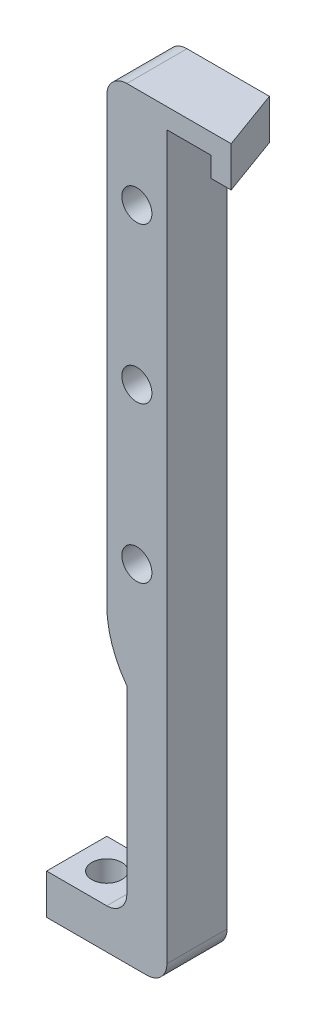
ISO-10303-21;
HEADER;
FILE_DESCRIPTION(('STEP AP214'),'2;1');
FILE_NAME('part.step','',(''),(''),'','','');
FILE_SCHEMA(('AUTOMOTIVE_DESIGN { 1 0 10303 214 1 1 1 1 }'));
ENDSEC;
DATA;
#1=APPLICATION_CONTEXT('core data for automotive mechanical design processes');
#2=APPLICATION_PROTOCOL_DEFINITION('international standard','automotive_design',2000,#1);
#3=PRODUCT_CONTEXT('',#1,'mechanical');
#4=PRODUCT('Part','Part','',(#3));
#5=PRODUCT_RELATED_PRODUCT_CATEGORY('part','',(#4));
#6=PRODUCT_DEFINITION_FORMATION('','',#4);
#7=PRODUCT_DEFINITION_CONTEXT('part definition',#1,'design');
#8=PRODUCT_DEFINITION('design','',#6,#7);
#9=PRODUCT_DEFINITION_SHAPE('','',#8);
#10=(LENGTH_UNIT() NAMED_UNIT(*) SI_UNIT(.MILLI.,.METRE.));
#11=(NAMED_UNIT(*) PLANE_ANGLE_UNIT() SI_UNIT($,.RADIAN.));
#12=(NAMED_UNIT(*) SI_UNIT($,.STERADIAN.) SOLID_ANGLE_UNIT());
#13=UNCERTAINTY_MEASURE_WITH_UNIT(LENGTH_MEASURE(1.E-05),#10,'distance_accuracy_value','');
#14=(GEOMETRIC_REPRESENTATION_CONTEXT(3) GLOBAL_UNCERTAINTY_ASSIGNED_CONTEXT((#13)) GLOBAL_UNIT_ASSIGNED_CONTEXT((#10,
#11,#12)) REPRESENTATION_CONTEXT('',''));
#15=CARTESIAN_POINT('',(0.,0.,0.));
#16=DIRECTION('',(0.,0.,1.));
#17=DIRECTION('',(1.,0.,0.));
#18=AXIS2_PLACEMENT_3D('',#15,#16,#17);
#19=CARTESIAN_POINT('',(15.748,93.98,0.));
#20=DIRECTION('',(0.,1.,0.));
#21=DIRECTION('',(0.,0.,1.));
#22=AXIS2_PLACEMENT_3D('',#19,#20,#21);
#23=PLANE('',#22);
#24=DIRECTION('',(-0.342020143325663,0.,-0.93969262078591));
#25=VECTOR('',#24,1.);
#26=CARTESIAN_POINT('',(10.4345468148915,93.98,-7.62));
#27=LINE('',#26,#25);
#28=CARTESIAN_POINT('',(13.2079999999999,93.98,0.));
#29=VERTEX_POINT('',#28);
#30=CARTESIAN_POINT('',(10.4345468148915,93.98,-7.62));
#31=VERTEX_POINT('',#30);
#32=EDGE_CURVE('E179',#29,#31,#27,.T.);
#33=ORIENTED_EDGE('',*,*,#32,.F.);
#34=DIRECTION('',(-1.,0.,0.));
#35=VECTOR('',#34,1.);
#36=CARTESIAN_POINT('',(15.748,93.98,0.));
#37=LINE('',#36,#35);
#38=CARTESIAN_POINT('',(7.62,93.9799999999999,0.));
#39=VERTEX_POINT('',#38);
#40=EDGE_CURVE('E221',#29,#39,#37,.T.);
#41=ORIENTED_EDGE('',*,*,#40,.T.);
#42=DIRECTION('',(0.,0.,-1.));
#43=VECTOR('',#42,1.);
#44=CARTESIAN_POINT('',(7.62,93.98,0.));
#45=LINE('',#44,#43);
#46=CARTESIAN_POINT('',(7.62,93.98,-7.62));
#47=VERTEX_POINT('',#46);
#48=EDGE_CURVE('E200',#39,#47,#45,.T.);
#49=ORIENTED_EDGE('',*,*,#48,.T.);
#50=DIRECTION('',(-1.,0.,0.));
#51=VECTOR('',#50,1.);
#52=CARTESIAN_POINT('',(15.748,93.98,-7.62));
#53=LINE('',#52,#51);
#54=EDGE_CURVE('E203',#31,#47,#53,.T.);
#55=ORIENTED_EDGE('',*,*,#54,.F.);
#56=EDGE_LOOP('',(#33,#41,#49,#55));
#57=FACE_BOUND('',#56,.T.);
#58=ADVANCED_FACE('F33',(#57),#23,.F.);
#59=CARTESIAN_POINT('',(7.62,0.,0.));
#60=DIRECTION('',(-1.,0.,0.));
#61=DIRECTION('',(0.,0.,1.));
#62=AXIS2_PLACEMENT_3D('',#59,#60,#61);
#63=PLANE('',#62);
#64=DIRECTION('',(0.,-1.,0.));
#65=VECTOR('',#64,1.);
#66=CARTESIAN_POINT('',(7.62,0.,0.));
#67=LINE('',#66,#65);
#68=CARTESIAN_POINT('',(7.62,2.54,0.));
#69=VERTEX_POINT('',#68);
#70=EDGE_CURVE('E212',#39,#69,#67,.T.);
#71=ORIENTED_EDGE('',*,*,#70,.T.);
#72=DIRECTION('',(0.,0.,-1.));
#73=VECTOR('',#72,1.);
#74=CARTESIAN_POINT('',(7.62,2.54,0.));
#75=LINE('',#74,#73);
#76=CARTESIAN_POINT('',(7.62,2.54,-7.62));
#77=VERTEX_POINT('',#76);
#78=EDGE_CURVE('E162',#69,#77,#75,.T.);
#79=ORIENTED_EDGE('',*,*,#78,.T.);
#80=DIRECTION('',(0.,1.,0.));
#81=VECTOR('',#80,1.);
#82=CARTESIAN_POINT('',(7.62,0.,-7.62));
#83=LINE('',#82,#81);
#84=EDGE_CURVE('E237',#77,#47,#83,.T.);
#85=ORIENTED_EDGE('',*,*,#84,.T.);
#86=ORIENTED_EDGE('',*,*,#48,.F.);
#87=EDGE_LOOP('',(#71,#79,#85,#86));
#88=FACE_BOUND('',#87,.T.);
#89=ADVANCED_FACE('F324',(#88),#63,.F.);
#90=CARTESIAN_POINT('',(7.62,0.,0.));
#91=DIRECTION('',(0.,0.,-1.));
#92=DIRECTION('',(-1.,0.,0.));
#93=AXIS2_PLACEMENT_3D('',#90,#91,#92);
#94=PLANE('',#93);
#95=CARTESIAN_POINT('',(3.81,64.135,0.));
#96=DIRECTION('',(0.,0.,1.));
#97=DIRECTION('',(1.,0.,0.));
#98=AXIS2_PLACEMENT_3D('',#95,#96,#97);
#99=CIRCLE('',#98,1.905);
#100=CARTESIAN_POINT('',(5.715,64.135,0.));
#101=VERTEX_POINT('',#100);
#102=EDGE_CURVE('E285',#101,#101,#99,.T.);
#103=ORIENTED_EDGE('',*,*,#102,.F.);
#104=EDGE_LOOP('',(#103));
#105=FACE_BOUND('',#104,.T.);
#106=CARTESIAN_POINT('',(3.81,44.45,0.));
#107=DIRECTION('',(0.,0.,1.));
#108=DIRECTION('',(1.,0.,0.));
#109=AXIS2_PLACEMENT_3D('',#106,#107,#108);
#110=CIRCLE('',#109,1.905);
#111=CARTESIAN_POINT('',(5.715,44.45,0.));
#112=VERTEX_POINT('',#111);
#113=EDGE_CURVE('E275',#112,#112,#110,.T.);
#114=ORIENTED_EDGE('',*,*,#113,.F.);
#115=EDGE_LOOP('',(#114));
#116=FACE_BOUND('',#115,.T.);
#117=CARTESIAN_POINT('',(3.81,83.82,0.));
#118=DIRECTION('',(0.,0.,1.));
#119=DIRECTION('',(1.,0.,0.));
#120=AXIS2_PLACEMENT_3D('',#117,#118,#119);
#121=CIRCLE('',#120,1.90500000000001);
#122=CARTESIAN_POINT('',(5.71500000000001,83.82,0.));
#123=VERTEX_POINT('',#122);
#124=EDGE_CURVE('E272',#123,#123,#121,.T.);
#125=ORIENTED_EDGE('',*,*,#124,.F.);
#126=EDGE_LOOP('',(#125));
#127=FACE_BOUND('',#126,.T.);
#128=DIRECTION('',(-1.,0.,0.));
#129=VECTOR('',#128,1.);
#130=CARTESIAN_POINT('',(7.62,0.,0.));
#131=LINE('',#130,#129);
#132=CARTESIAN_POINT('',(5.08,0.,0.));
#133=VERTEX_POINT('',#132);
#134=CARTESIAN_POINT('',(-7.62,0.,0.));
#135=VERTEX_POINT('',#134);
#136=EDGE_CURVE('E242',#133,#135,#131,.T.);
#137=ORIENTED_EDGE('',*,*,#136,.F.);
#138=CARTESIAN_POINT('',(5.08,2.54,0.));
#139=DIRECTION('',(0.,0.,-1.));
#140=DIRECTION('',(-1.,0.,0.));
#141=AXIS2_PLACEMENT_3D('',#138,#139,#140);
#142=CIRCLE('',#141,2.54);
#143=EDGE_CURVE('E260',#133,#69,#142,.F.);
#144=ORIENTED_EDGE('',*,*,#143,.T.);
#145=ORIENTED_EDGE('',*,*,#70,.F.);
#146=ORIENTED_EDGE('',*,*,#40,.F.);
#147=DIRECTION('',(0.,1.,0.));
#148=VECTOR('',#147,1.);
#149=CARTESIAN_POINT('',(13.2079999999999,91.44,0.));
#150=LINE('',#149,#148);
#151=CARTESIAN_POINT('',(13.2079999999999,91.44,0.));
#152=VERTEX_POINT('',#151);
#153=EDGE_CURVE('E197',#152,#29,#150,.T.);
#154=ORIENTED_EDGE('',*,*,#153,.F.);
#155=DIRECTION('',(-1.,0.,0.));
#156=VECTOR('',#155,1.);
#157=CARTESIAN_POINT('',(15.748,91.44,0.));
#158=LINE('',#157,#156);
#159=CARTESIAN_POINT('',(15.748,91.44,0.));
#160=VERTEX_POINT('',#159);
#161=EDGE_CURVE('E180',#160,#152,#158,.T.);
#162=ORIENTED_EDGE('',*,*,#161,.F.);
#163=DIRECTION('',(0.,-1.,0.));
#164=VECTOR('',#163,1.);
#165=CARTESIAN_POINT('',(15.748,96.52,0.));
#166=LINE('',#165,#164);
#167=CARTESIAN_POINT('',(15.748,96.52,0.));
#168=VERTEX_POINT('',#167);
#169=EDGE_CURVE('E201',#168,#160,#166,.T.);
#170=ORIENTED_EDGE('',*,*,#169,.F.);
#171=DIRECTION('',(-1.,0.,0.));
#172=VECTOR('',#171,1.);
#173=CARTESIAN_POINT('',(7.62,96.52,0.));
#174=LINE('',#173,#172);
#175=CARTESIAN_POINT('',(2.54,96.52,0.));
#176=VERTEX_POINT('',#175);
#177=EDGE_CURVE('E233',#168,#176,#174,.T.);
#178=ORIENTED_EDGE('',*,*,#177,.T.);
#179=CARTESIAN_POINT('',(2.54,93.98,0.));
#180=DIRECTION('',(0.,0.,-1.));
#181=DIRECTION('',(-1.,0.,0.));
#182=AXIS2_PLACEMENT_3D('',#179,#180,#181);
#183=CIRCLE('',#182,2.54);
#184=CARTESIAN_POINT('',(0.,93.98,0.));
#185=VERTEX_POINT('',#184);
#186=EDGE_CURVE('E50',#176,#185,#183,.F.);
#187=ORIENTED_EDGE('',*,*,#186,.T.);
#188=DIRECTION('',(0.,-1.,0.));
#189=VECTOR('',#188,1.);
#190=CARTESIAN_POINT('',(0.,0.,0.));
#191=LINE('',#190,#189);
#192=CARTESIAN_POINT('',(0.,38.1,0.));
#193=VERTEX_POINT('',#192);
#194=EDGE_CURVE('E158',#185,#193,#191,.T.);
#195=ORIENTED_EDGE('',*,*,#194,.T.);
#196=CARTESIAN_POINT('',(12.7,38.1,0.));
#197=DIRECTION('',(0.,0.,-1.));
#198=DIRECTION('',(-1.,0.,0.));
#199=AXIS2_PLACEMENT_3D('',#196,#197,#198);
#200=CIRCLE('',#199,12.7);
#201=CARTESIAN_POINT('',(2.54,30.48,0.));
#202=VERTEX_POINT('',#201);
#203=EDGE_CURVE('E154',#193,#202,#200,.F.);
#204=ORIENTED_EDGE('',*,*,#203,.T.);
#205=DIRECTION('',(0.,1.,0.));
#206=VECTOR('',#205,1.);
#207=CARTESIAN_POINT('',(2.54,5.08,0.));
#208=LINE('',#207,#206);
#209=CARTESIAN_POINT('',(2.54,7.62,0.));
#210=VERTEX_POINT('',#209);
#211=EDGE_CURVE('E142',#210,#202,#208,.T.);
#212=ORIENTED_EDGE('',*,*,#211,.F.);
#213=CARTESIAN_POINT('',(0.,7.62,0.));
#214=DIRECTION('',(0.,0.,-1.));
#215=DIRECTION('',(-1.,0.,0.));
#216=AXIS2_PLACEMENT_3D('',#213,#214,#215);
#217=CIRCLE('',#216,2.54);
#218=CARTESIAN_POINT('',(0.,5.08,0.));
#219=VERTEX_POINT('',#218);
#220=EDGE_CURVE('E42',#210,#219,#217,.T.);
#221=ORIENTED_EDGE('',*,*,#220,.T.);
#222=DIRECTION('',(1.,0.,0.));
#223=VECTOR('',#222,1.);
#224=CARTESIAN_POINT('',(-7.62,5.08,0.));
#225=LINE('',#224,#223);
#226=CARTESIAN_POINT('',(-7.62,5.08,0.));
#227=VERTEX_POINT('',#226);
#228=EDGE_CURVE('E247',#227,#219,#225,.T.);
#229=ORIENTED_EDGE('',*,*,#228,.F.);
#230=DIRECTION('',(0.,1.,0.));
#231=VECTOR('',#230,1.);
#232=CARTESIAN_POINT('',(-7.62,0.,0.));
#233=LINE('',#232,#231);
#234=EDGE_CURVE('E206',#135,#227,#233,.T.);
#235=ORIENTED_EDGE('',*,*,#234,.F.);
#236=EDGE_LOOP('',(#137,#144,#145,#146,#154,#162,#170,#178,#187,#195,#204,#212,#221,#229,#235));
#237=FACE_BOUND('',#236,.T.);
#238=ADVANCED_FACE('F156',(#105,#116,#127,#237),#94,.F.);
#239=CARTESIAN_POINT('',(7.62,0.,0.));
#240=DIRECTION('',(0.,1.,0.));
#241=DIRECTION('',(0.,0.,1.));
#242=AXIS2_PLACEMENT_3D('',#239,#240,#241);
#243=PLANE('',#242);
#244=CARTESIAN_POINT('',(-3.81,0.,-3.81));
#245=DIRECTION('',(0.,1.,0.));
#246=DIRECTION('',(0.,0.,1.));
#247=AXIS2_PLACEMENT_3D('',#244,#245,#246);
#248=CIRCLE('',#247,1.89865);
#249=CARTESIAN_POINT('',(-3.81,0.,-1.91135));
#250=VERTEX_POINT('',#249);
#251=EDGE_CURVE('E176',#250,#250,#248,.T.);
#252=ORIENTED_EDGE('',*,*,#251,.T.);
#253=EDGE_LOOP('',(#252));
#254=FACE_BOUND('',#253,.T.);
#255=DIRECTION('',(-1.,0.,0.));
#256=VECTOR('',#255,1.);
#257=CARTESIAN_POINT('',(7.62,0.,-7.62));
#258=LINE('',#257,#256);
#259=CARTESIAN_POINT('',(5.08,0.,-7.62));
#260=VERTEX_POINT('',#259);
#261=CARTESIAN_POINT('',(-7.62,0.,-7.62));
#262=VERTEX_POINT('',#261);
#263=EDGE_CURVE('E240',#260,#262,#258,.T.);
#264=ORIENTED_EDGE('',*,*,#263,.F.);
#265=DIRECTION('',(0.,0.,-1.));
#266=VECTOR('',#265,1.);
#267=CARTESIAN_POINT('',(5.08,0.,0.));
#268=LINE('',#267,#266);
#269=EDGE_CURVE('E257',#260,#133,#268,.F.);
#270=ORIENTED_EDGE('',*,*,#269,.T.);
#271=ORIENTED_EDGE('',*,*,#136,.T.);
#272=DIRECTION('',(0.,0.,1.));
#273=VECTOR('',#272,1.);
#274=CARTESIAN_POINT('',(-7.62,0.,0.));
#275=LINE('',#274,#273);
#276=EDGE_CURVE('E248',#262,#135,#275,.T.);
#277=ORIENTED_EDGE('',*,*,#276,.F.);
#278=EDGE_LOOP('',(#264,#270,#271,#277));
#279=FACE_BOUND('',#278,.T.);
#280=ADVANCED_FACE('F314',(#254,#279),#243,.F.);
#281=CARTESIAN_POINT('',(7.62,0.,-7.62));
#282=DIRECTION('',(0.,0.,1.));
#283=DIRECTION('',(1.,0.,0.));
#284=AXIS2_PLACEMENT_3D('',#281,#282,#283);
#285=PLANE('',#284);
#286=CARTESIAN_POINT('',(3.81,64.135,-7.62));
#287=DIRECTION('',(0.,0.,1.));
#288=DIRECTION('',(1.,0.,0.));
#289=AXIS2_PLACEMENT_3D('',#286,#287,#288);
#290=CIRCLE('',#289,1.905);
#291=CARTESIAN_POINT('',(5.715,64.135,-7.62));
#292=VERTEX_POINT('',#291);
#293=EDGE_CURVE('E37',#292,#292,#290,.T.);
#294=ORIENTED_EDGE('',*,*,#293,.T.);
#295=EDGE_LOOP('',(#294));
#296=FACE_BOUND('',#295,.T.);
#297=CARTESIAN_POINT('',(3.81,44.45,-7.62));
#298=DIRECTION('',(0.,0.,1.));
#299=DIRECTION('',(1.,0.,0.));
#300=AXIS2_PLACEMENT_3D('',#297,#298,#299);
#301=CIRCLE('',#300,1.905);
#302=CARTESIAN_POINT('',(5.715,44.45,-7.62));
#303=VERTEX_POINT('',#302);
#304=EDGE_CURVE('E273',#303,#303,#301,.T.);
#305=ORIENTED_EDGE('',*,*,#304,.T.);
#306=EDGE_LOOP('',(#305));
#307=FACE_BOUND('',#306,.T.);
#308=CARTESIAN_POINT('',(3.81,83.82,-7.62));
#309=DIRECTION('',(0.,0.,1.));
#310=DIRECTION('',(1.,0.,0.));
#311=AXIS2_PLACEMENT_3D('',#308,#309,#310);
#312=CIRCLE('',#311,1.90500000000001);
#313=CARTESIAN_POINT('',(5.71500000000001,83.82,-7.62));
#314=VERTEX_POINT('',#313);
#315=EDGE_CURVE('E270',#314,#314,#312,.T.);
#316=ORIENTED_EDGE('',*,*,#315,.T.);
#317=EDGE_LOOP('',(#316));
#318=FACE_BOUND('',#317,.T.);
#319=ORIENTED_EDGE('',*,*,#84,.F.);
#320=CARTESIAN_POINT('',(5.08,2.54,-7.62));
#321=DIRECTION('',(0.,0.,1.));
#322=DIRECTION('',(1.,0.,0.));
#323=AXIS2_PLACEMENT_3D('',#320,#321,#322);
#324=CIRCLE('',#323,2.54);
#325=EDGE_CURVE('E311',#77,#260,#324,.F.);
#326=ORIENTED_EDGE('',*,*,#325,.T.);
#327=ORIENTED_EDGE('',*,*,#263,.T.);
#328=DIRECTION('',(0.,-1.,0.));
#329=VECTOR('',#328,1.);
#330=CARTESIAN_POINT('',(-7.62,0.,-7.62));
#331=LINE('',#330,#329);
#332=CARTESIAN_POINT('',(-7.62,5.08,-7.62));
#333=VERTEX_POINT('',#332);
#334=EDGE_CURVE('E296',#333,#262,#331,.T.);
#335=ORIENTED_EDGE('',*,*,#334,.F.);
#336=DIRECTION('',(1.,0.,0.));
#337=VECTOR('',#336,1.);
#338=CARTESIAN_POINT('',(-7.62,5.08,-7.62));
#339=LINE('',#338,#337);
#340=CARTESIAN_POINT('',(0.,5.08,-7.62));
#341=VERTEX_POINT('',#340);
#342=EDGE_CURVE('E244',#333,#341,#339,.T.);
#343=ORIENTED_EDGE('',*,*,#342,.T.);
#344=CARTESIAN_POINT('',(0.,7.62,-7.62));
#345=DIRECTION('',(0.,0.,1.));
#346=DIRECTION('',(1.,0.,0.));
#347=AXIS2_PLACEMENT_3D('',#344,#345,#346);
#348=CIRCLE('',#347,2.54);
#349=CARTESIAN_POINT('',(2.54,7.62,-7.62));
#350=VERTEX_POINT('',#349);
#351=EDGE_CURVE('E11',#341,#350,#348,.T.);
#352=ORIENTED_EDGE('',*,*,#351,.T.);
#353=DIRECTION('',(0.,-1.,0.));
#354=VECTOR('',#353,1.);
#355=CARTESIAN_POINT('',(2.54,5.08,-7.62));
#356=LINE('',#355,#354);
#357=CARTESIAN_POINT('',(2.54,30.48,-7.62));
#358=VERTEX_POINT('',#357);
#359=EDGE_CURVE('E151',#358,#350,#356,.T.);
#360=ORIENTED_EDGE('',*,*,#359,.F.);
#361=CARTESIAN_POINT('',(12.7,38.1,-7.62));
#362=DIRECTION('',(0.,0.,1.));
#363=DIRECTION('',(1.,0.,0.));
#364=AXIS2_PLACEMENT_3D('',#361,#362,#363);
#365=CIRCLE('',#364,12.7);
#366=CARTESIAN_POINT('',(0.,38.1,-7.62));
#367=VERTEX_POINT('',#366);
#368=EDGE_CURVE('E166',#358,#367,#365,.F.);
#369=ORIENTED_EDGE('',*,*,#368,.T.);
#370=DIRECTION('',(0.,1.,0.));
#371=VECTOR('',#370,1.);
#372=CARTESIAN_POINT('',(0.,0.,-7.62));
#373=LINE('',#372,#371);
#374=CARTESIAN_POINT('',(0.,93.98,-7.62));
#375=VERTEX_POINT('',#374);
#376=EDGE_CURVE('E223',#367,#375,#373,.T.);
#377=ORIENTED_EDGE('',*,*,#376,.T.);
#378=CARTESIAN_POINT('',(2.54,93.98,-7.62));
#379=DIRECTION('',(0.,0.,1.));
#380=DIRECTION('',(1.,0.,0.));
#381=AXIS2_PLACEMENT_3D('',#378,#379,#380);
#382=CIRCLE('',#381,2.54);
#383=CARTESIAN_POINT('',(2.54,96.52,-7.62));
#384=VERTEX_POINT('',#383);
#385=EDGE_CURVE('E310',#375,#384,#382,.F.);
#386=ORIENTED_EDGE('',*,*,#385,.T.);
#387=DIRECTION('',(-1.,0.,0.));
#388=VECTOR('',#387,1.);
#389=CARTESIAN_POINT('',(7.62,96.52,-7.62));
#390=LINE('',#389,#388);
#391=CARTESIAN_POINT('',(12.9745468148915,96.52,-7.62));
#392=VERTEX_POINT('',#391);
#393=EDGE_CURVE('E236',#392,#384,#390,.T.);
#394=ORIENTED_EDGE('',*,*,#393,.F.);
#395=DIRECTION('',(0.,1.,0.));
#396=VECTOR('',#395,1.);
#397=CARTESIAN_POINT('',(12.9745468148915,91.44,-7.62));
#398=LINE('',#397,#396);
#399=CARTESIAN_POINT('',(12.9745468148915,91.44,-7.62));
#400=VERTEX_POINT('',#399);
#401=EDGE_CURVE('E190',#400,#392,#398,.T.);
#402=ORIENTED_EDGE('',*,*,#401,.F.);
#403=DIRECTION('',(1.,0.,0.));
#404=VECTOR('',#403,1.);
#405=CARTESIAN_POINT('',(10.4345468148915,91.44,-7.62));
#406=LINE('',#405,#404);
#407=CARTESIAN_POINT('',(10.4345468148915,91.44,-7.62));
#408=VERTEX_POINT('',#407);
#409=EDGE_CURVE('E185',#408,#400,#406,.T.);
#410=ORIENTED_EDGE('',*,*,#409,.F.);
#411=DIRECTION('',(0.,1.,0.));
#412=VECTOR('',#411,1.);
#413=CARTESIAN_POINT('',(10.4345468148915,91.44,-7.62));
#414=LINE('',#413,#412);
#415=EDGE_CURVE('E194',#408,#31,#414,.T.);
#416=ORIENTED_EDGE('',*,*,#415,.T.);
#417=ORIENTED_EDGE('',*,*,#54,.T.);
#418=EDGE_LOOP('',(#319,#326,#327,#335,#343,#352,#360,#369,#377,#386,#394,#402,#410,#416,#417));
#419=FACE_BOUND('',#418,.T.);
#420=ADVANCED_FACE('F294',(#296,#307,#318,#419),#285,.F.);
#421=CARTESIAN_POINT('',(7.62,96.52,0.));
#422=DIRECTION('',(0.,-1.,0.));
#423=DIRECTION('',(0.,0.,-1.));
#424=AXIS2_PLACEMENT_3D('',#421,#422,#423);
#425=PLANE('',#424);
#426=ORIENTED_EDGE('',*,*,#393,.T.);
#427=DIRECTION('',(0.,0.,1.));
#428=VECTOR('',#427,1.);
#429=CARTESIAN_POINT('',(2.54,96.52,0.));
#430=LINE('',#429,#428);
#431=EDGE_CURVE('E262',#384,#176,#430,.T.);
#432=ORIENTED_EDGE('',*,*,#431,.T.);
#433=ORIENTED_EDGE('',*,*,#177,.F.);
#434=DIRECTION('',(-0.342020143325669,0.,-0.939692620785908));
#435=VECTOR('',#434,1.);
#436=CARTESIAN_POINT('',(12.9745468148915,96.52,-7.62));
#437=LINE('',#436,#435);
#438=EDGE_CURVE('E167',#168,#392,#437,.T.);
#439=ORIENTED_EDGE('',*,*,#438,.T.);
#440=EDGE_LOOP('',(#426,#432,#433,#439));
#441=FACE_BOUND('',#440,.T.);
#442=ADVANCED_FACE('F344',(#441),#425,.F.);
#443=CARTESIAN_POINT('',(0.,0.,0.));
#444=DIRECTION('',(-1.,0.,0.));
#445=DIRECTION('',(0.,0.,1.));
#446=AXIS2_PLACEMENT_3D('',#443,#444,#445);
#447=PLANE('',#446);
#448=ORIENTED_EDGE('',*,*,#194,.F.);
#449=DIRECTION('',(0.,0.,1.));
#450=VECTOR('',#449,1.);
#451=CARTESIAN_POINT('',(0.,93.98,-7.62));
#452=LINE('',#451,#450);
#453=EDGE_CURVE('E264',#185,#375,#452,.F.);
#454=ORIENTED_EDGE('',*,*,#453,.T.);
#455=ORIENTED_EDGE('',*,*,#376,.F.);
#456=DIRECTION('',(0.,0.,1.));
#457=VECTOR('',#456,1.);
#458=CARTESIAN_POINT('',(0.,38.1,0.));
#459=LINE('',#458,#457);
#460=EDGE_CURVE('E163',#367,#193,#459,.T.);
#461=ORIENTED_EDGE('',*,*,#460,.T.);
#462=EDGE_LOOP('',(#448,#454,#455,#461));
#463=FACE_BOUND('',#462,.T.);
#464=ADVANCED_FACE('F349',(#463),#447,.T.);
#465=CARTESIAN_POINT('',(-7.62,5.08,0.));
#466=DIRECTION('',(0.,-1.,0.));
#467=DIRECTION('',(0.,0.,-1.));
#468=AXIS2_PLACEMENT_3D('',#465,#466,#467);
#469=PLANE('',#468);
#470=CARTESIAN_POINT('',(-3.81,5.08,-3.81));
#471=DIRECTION('',(0.,1.,0.));
#472=DIRECTION('',(0.,0.,1.));
#473=AXIS2_PLACEMENT_3D('',#470,#471,#472);
#474=CIRCLE('',#473,1.89865);
#475=CARTESIAN_POINT('',(-3.81,5.08,-1.91135));
#476=VERTEX_POINT('',#475);
#477=EDGE_CURVE('E170',#476,#476,#474,.T.);
#478=ORIENTED_EDGE('',*,*,#477,.F.);
#479=EDGE_LOOP('',(#478));
#480=FACE_BOUND('',#479,.T.);
#481=ORIENTED_EDGE('',*,*,#228,.T.);
#482=DIRECTION('',(0.,0.,1.));
#483=VECTOR('',#482,1.);
#484=CARTESIAN_POINT('',(0.,5.08,-7.62));
#485=LINE('',#484,#483);
#486=EDGE_CURVE('E267',#219,#341,#485,.F.);
#487=ORIENTED_EDGE('',*,*,#486,.T.);
#488=ORIENTED_EDGE('',*,*,#342,.F.);
#489=DIRECTION('',(0.,0.,-1.));
#490=VECTOR('',#489,1.);
#491=CARTESIAN_POINT('',(-7.62,5.08,0.));
#492=LINE('',#491,#490);
#493=EDGE_CURVE('E301',#227,#333,#492,.T.);
#494=ORIENTED_EDGE('',*,*,#493,.F.);
#495=EDGE_LOOP('',(#481,#487,#488,#494));
#496=FACE_BOUND('',#495,.T.);
#497=ADVANCED_FACE('F291',(#480,#496),#469,.F.);
#498=CARTESIAN_POINT('',(-7.62,0.,0.));
#499=DIRECTION('',(-1.,0.,0.));
#500=DIRECTION('',(0.,0.,1.));
#501=AXIS2_PLACEMENT_3D('',#498,#499,#500);
#502=PLANE('',#501);
#503=ORIENTED_EDGE('',*,*,#234,.T.);
#504=ORIENTED_EDGE('',*,*,#493,.T.);
#505=ORIENTED_EDGE('',*,*,#334,.T.);
#506=ORIENTED_EDGE('',*,*,#276,.T.);
#507=EDGE_LOOP('',(#503,#504,#505,#506));
#508=FACE_BOUND('',#507,.T.);
#509=ADVANCED_FACE('F356',(#508),#502,.T.);
#510=CARTESIAN_POINT('',(10.4345468148915,91.44,-7.62));
#511=DIRECTION('',(0.939692620785911,0.,-0.342020143325663));
#512=DIRECTION('',(-0.342020143325663,0.,-0.939692620785911));
#513=AXIS2_PLACEMENT_3D('',#510,#511,#512);
#514=PLANE('',#513);
#515=ORIENTED_EDGE('',*,*,#32,.T.);
#516=ORIENTED_EDGE('',*,*,#415,.F.);
#517=DIRECTION('',(-0.342020143325663,0.,-0.93969262078591));
#518=VECTOR('',#517,1.);
#519=CARTESIAN_POINT('',(10.4345468148915,91.44,-7.62));
#520=LINE('',#519,#518);
#521=EDGE_CURVE('E183',#152,#408,#520,.T.);
#522=ORIENTED_EDGE('',*,*,#521,.F.);
#523=ORIENTED_EDGE('',*,*,#153,.T.);
#524=EDGE_LOOP('',(#515,#516,#522,#523));
#525=FACE_BOUND('',#524,.T.);
#526=ADVANCED_FACE('F333',(#525),#514,.F.);
#527=CARTESIAN_POINT('',(15.748,91.44,0.));
#528=DIRECTION('',(-0.939692620785908,0.,0.342020143325669));
#529=DIRECTION('',(0.342020143325669,0.,0.939692620785908));
#530=AXIS2_PLACEMENT_3D('',#527,#528,#529);
#531=PLANE('',#530);
#532=ORIENTED_EDGE('',*,*,#401,.T.);
#533=ORIENTED_EDGE('',*,*,#438,.F.);
#534=ORIENTED_EDGE('',*,*,#169,.T.);
#535=DIRECTION('',(0.342020143325669,0.,0.939692620785908));
#536=VECTOR('',#535,1.);
#537=CARTESIAN_POINT('',(15.748,91.44,0.));
#538=LINE('',#537,#536);
#539=EDGE_CURVE('E187',#400,#160,#538,.T.);
#540=ORIENTED_EDGE('',*,*,#539,.F.);
#541=EDGE_LOOP('',(#532,#533,#534,#540));
#542=FACE_BOUND('',#541,.T.);
#543=ADVANCED_FACE('F340',(#542),#531,.F.);
#544=CARTESIAN_POINT('',(0.,91.44,0.));
#545=DIRECTION('',(0.,1.,0.));
#546=DIRECTION('',(0.,0.,1.));
#547=AXIS2_PLACEMENT_3D('',#544,#545,#546);
#548=PLANE('',#547);
#549=ORIENTED_EDGE('',*,*,#161,.T.);
#550=ORIENTED_EDGE('',*,*,#521,.T.);
#551=ORIENTED_EDGE('',*,*,#409,.T.);
#552=ORIENTED_EDGE('',*,*,#539,.T.);
#553=EDGE_LOOP('',(#549,#550,#551,#552));
#554=FACE_BOUND('',#553,.T.);
#555=ADVANCED_FACE('F335',(#554),#548,.F.);
#556=CARTESIAN_POINT('',(-3.81,5.08,-3.81));
#557=DIRECTION('',(0.,1.,0.));
#558=DIRECTION('',(0.,0.,1.));
#559=AXIS2_PLACEMENT_3D('',#556,#557,#558);
#560=CYLINDRICAL_SURFACE('',#559,1.89865);
#561=ORIENTED_EDGE('',*,*,#251,.F.);
#562=EDGE_LOOP('',(#561));
#563=FACE_BOUND('',#562,.T.);
#564=ORIENTED_EDGE('',*,*,#477,.T.);
#565=EDGE_LOOP('',(#564));
#566=FACE_BOUND('',#565,.T.);
#567=ADVANCED_FACE('F379',(#563,#566),#560,.F.);
#568=CARTESIAN_POINT('',(2.54,0.,0.));
#569=DIRECTION('',(1.,0.,0.));
#570=DIRECTION('',(0.,0.,-1.));
#571=AXIS2_PLACEMENT_3D('',#568,#569,#570);
#572=PLANE('',#571);
#573=ORIENTED_EDGE('',*,*,#359,.T.);
#574=DIRECTION('',(0.,0.,1.));
#575=VECTOR('',#574,1.);
#576=CARTESIAN_POINT('',(2.54,7.62,0.));
#577=LINE('',#576,#575);
#578=EDGE_CURVE('E150',#350,#210,#577,.T.);
#579=ORIENTED_EDGE('',*,*,#578,.T.);
#580=ORIENTED_EDGE('',*,*,#211,.T.);
#581=DIRECTION('',(0.,0.,-1.));
#582=VECTOR('',#581,1.);
#583=CARTESIAN_POINT('',(2.54,30.48,-7.62));
#584=LINE('',#583,#582);
#585=EDGE_CURVE('E147',#202,#358,#584,.T.);
#586=ORIENTED_EDGE('',*,*,#585,.T.);
#587=EDGE_LOOP('',(#573,#579,#580,#586));
#588=FACE_BOUND('',#587,.T.);
#589=ADVANCED_FACE('F145',(#588),#572,.F.);
#590=CARTESIAN_POINT('',(12.7,38.1,-7.62));
#591=DIRECTION('',(0.,0.,-1.));
#592=DIRECTION('',(-1.,0.,0.));
#593=AXIS2_PLACEMENT_3D('',#590,#591,#592);
#594=CYLINDRICAL_SURFACE('',#593,12.7);
#595=ORIENTED_EDGE('',*,*,#203,.F.);
#596=ORIENTED_EDGE('',*,*,#460,.F.);
#597=ORIENTED_EDGE('',*,*,#368,.F.);
#598=ORIENTED_EDGE('',*,*,#585,.F.);
#599=EDGE_LOOP('',(#595,#596,#597,#598));
#600=FACE_BOUND('',#599,.T.);
#601=ADVANCED_FACE('F165',(#600),#594,.T.);
#602=CARTESIAN_POINT('',(5.08,2.54,0.));
#603=DIRECTION('',(0.,0.,-1.));
#604=DIRECTION('',(-1.,0.,0.));
#605=AXIS2_PLACEMENT_3D('',#602,#603,#604);
#606=CYLINDRICAL_SURFACE('',#605,2.54);
#607=ORIENTED_EDGE('',*,*,#143,.F.);
#608=ORIENTED_EDGE('',*,*,#269,.F.);
#609=ORIENTED_EDGE('',*,*,#325,.F.);
#610=ORIENTED_EDGE('',*,*,#78,.F.);
#611=EDGE_LOOP('',(#607,#608,#609,#610));
#612=FACE_BOUND('',#611,.T.);
#613=ADVANCED_FACE('F322',(#612),#606,.T.);
#614=CARTESIAN_POINT('',(2.54,93.98,0.));
#615=DIRECTION('',(0.,0.,-1.));
#616=DIRECTION('',(-1.,0.,0.));
#617=AXIS2_PLACEMENT_3D('',#614,#615,#616);
#618=CYLINDRICAL_SURFACE('',#617,2.54);
#619=ORIENTED_EDGE('',*,*,#385,.F.);
#620=ORIENTED_EDGE('',*,*,#453,.F.);
#621=ORIENTED_EDGE('',*,*,#186,.F.);
#622=ORIENTED_EDGE('',*,*,#431,.F.);
#623=EDGE_LOOP('',(#619,#620,#621,#622));
#624=FACE_BOUND('',#623,.T.);
#625=ADVANCED_FACE('F346',(#624),#618,.T.);
#626=CARTESIAN_POINT('',(0.,7.62,0.));
#627=DIRECTION('',(0.,0.,-1.));
#628=DIRECTION('',(0.,1.,0.));
#629=AXIS2_PLACEMENT_3D('',#626,#627,#628);
#630=CYLINDRICAL_SURFACE('',#629,2.54);
#631=ORIENTED_EDGE('',*,*,#351,.F.);
#632=ORIENTED_EDGE('',*,*,#486,.F.);
#633=ORIENTED_EDGE('',*,*,#220,.F.);
#634=ORIENTED_EDGE('',*,*,#578,.F.);
#635=EDGE_LOOP('',(#631,#632,#633,#634));
#636=FACE_BOUND('',#635,.T.);
#637=ADVANCED_FACE('F35',(#636),#630,.F.);
#638=CARTESIAN_POINT('',(3.81,83.82,-7.62005));
#639=DIRECTION('',(0.,0.,1.));
#640=DIRECTION('',(1.,0.,0.));
#641=AXIS2_PLACEMENT_3D('',#638,#639,#640);
#642=CYLINDRICAL_SURFACE('',#641,1.90500000000001);
#643=ORIENTED_EDGE('',*,*,#124,.T.);
#644=EDGE_LOOP('',(#643));
#645=FACE_BOUND('',#644,.T.);
#646=ORIENTED_EDGE('',*,*,#315,.F.);
#647=EDGE_LOOP('',(#646));
#648=FACE_BOUND('',#647,.T.);
#649=ADVANCED_FACE('F387',(#645,#648),#642,.F.);
#650=CARTESIAN_POINT('',(3.81,44.45,-7.62005));
#651=DIRECTION('',(0.,0.,1.));
#652=DIRECTION('',(1.,0.,0.));
#653=AXIS2_PLACEMENT_3D('',#650,#651,#652);
#654=CYLINDRICAL_SURFACE('',#653,1.905);
#655=ORIENTED_EDGE('',*,*,#113,.T.);
#656=EDGE_LOOP('',(#655));
#657=FACE_BOUND('',#656,.T.);
#658=ORIENTED_EDGE('',*,*,#304,.F.);
#659=EDGE_LOOP('',(#658));
#660=FACE_BOUND('',#659,.T.);
#661=ADVANCED_FACE('F390',(#657,#660),#654,.F.);
#662=CARTESIAN_POINT('',(3.81,64.135,-7.62005));
#663=DIRECTION('',(0.,0.,1.));
#664=DIRECTION('',(1.,0.,0.));
#665=AXIS2_PLACEMENT_3D('',#662,#663,#664);
#666=CYLINDRICAL_SURFACE('',#665,1.905);
#667=ORIENTED_EDGE('',*,*,#102,.T.);
#668=EDGE_LOOP('',(#667));
#669=FACE_BOUND('',#668,.T.);
#670=ORIENTED_EDGE('',*,*,#293,.F.);
#671=EDGE_LOOP('',(#670));
#672=FACE_BOUND('',#671,.T.);
#673=ADVANCED_FACE('F394',(#669,#672),#666,.F.);
#674=CLOSED_SHELL('',(#58,#89,#238,#280,#420,#442,#464,#497,#509,#526,#543,#555,#567,#589,#601,
#613,#625,#637,#649,#661,#673));
#675=MANIFOLD_SOLID_BREP('B2',#674);
#676=ADVANCED_BREP_SHAPE_REPRESENTATION('',(#18,#675),#14);
#677=SHAPE_DEFINITION_REPRESENTATION(#9,#676);
ENDSEC;
END-ISO-10303-21;
